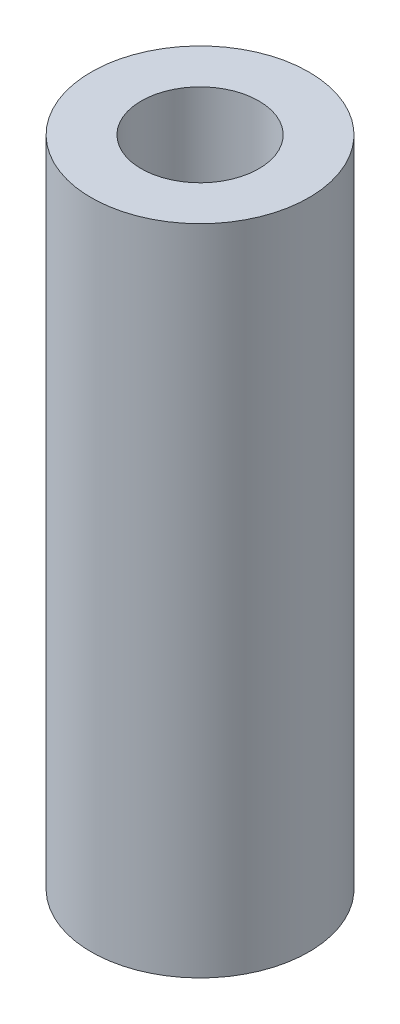
ISO-10303-21;
HEADER;
FILE_DESCRIPTION(('STEP AP214'),'2;1');
FILE_NAME('part.step','',(''),(''),'','','');
FILE_SCHEMA(('AUTOMOTIVE_DESIGN { 1 0 10303 214 1 1 1 1 }'));
ENDSEC;
DATA;
#1=APPLICATION_CONTEXT('core data for automotive mechanical design processes');
#2=APPLICATION_PROTOCOL_DEFINITION('international standard','automotive_design',2000,#1);
#3=PRODUCT_CONTEXT('',#1,'mechanical');
#4=PRODUCT('Part','Part','',(#3));
#5=PRODUCT_RELATED_PRODUCT_CATEGORY('part','',(#4));
#6=PRODUCT_DEFINITION_FORMATION('','',#4);
#7=PRODUCT_DEFINITION_CONTEXT('part definition',#1,'design');
#8=PRODUCT_DEFINITION('design','',#6,#7);
#9=PRODUCT_DEFINITION_SHAPE('','',#8);
#10=(LENGTH_UNIT() NAMED_UNIT(*) SI_UNIT(.MILLI.,.METRE.));
#11=(NAMED_UNIT(*) PLANE_ANGLE_UNIT() SI_UNIT($,.RADIAN.));
#12=(NAMED_UNIT(*) SI_UNIT($,.STERADIAN.) SOLID_ANGLE_UNIT());
#13=UNCERTAINTY_MEASURE_WITH_UNIT(LENGTH_MEASURE(1.E-05),#10,'distance_accuracy_value','');
#14=(GEOMETRIC_REPRESENTATION_CONTEXT(3) GLOBAL_UNCERTAINTY_ASSIGNED_CONTEXT((#13)) GLOBAL_UNIT_ASSIGNED_CONTEXT((#10,
#11,#12)) REPRESENTATION_CONTEXT('',''));
#15=CARTESIAN_POINT('',(0.,0.,0.));
#16=DIRECTION('',(0.,0.,1.));
#17=DIRECTION('',(1.,0.,0.));
#18=AXIS2_PLACEMENT_3D('',#15,#16,#17);
#19=CARTESIAN_POINT('',(0.,38.1,0.));
#20=DIRECTION('',(0.,1.,0.));
#21=DIRECTION('',(0.,0.,1.));
#22=AXIS2_PLACEMENT_3D('',#19,#20,#21);
#23=PLANE('',#22);
#24=CARTESIAN_POINT('',(0.,38.1,0.));
#25=DIRECTION('',(0.,1.,0.));
#26=DIRECTION('',(0.,0.,1.));
#27=AXIS2_PLACEMENT_3D('',#24,#25,#26);
#28=CIRCLE('',#27,6.35);
#29=CARTESIAN_POINT('',(0.,38.1,-6.35));
#30=VERTEX_POINT('',#29);
#31=EDGE_CURVE('E10',#30,#30,#28,.T.);
#32=ORIENTED_EDGE('',*,*,#31,.T.);
#33=EDGE_LOOP('',(#32));
#34=FACE_BOUND('',#33,.T.);
#35=CARTESIAN_POINT('',(0.,38.1,0.));
#36=DIRECTION('',(0.,1.,0.));
#37=DIRECTION('',(0.,0.,1.));
#38=AXIS2_PLACEMENT_3D('',#35,#36,#37);
#39=CIRCLE('',#38,3.429);
#40=CARTESIAN_POINT('',(0.,38.1,-3.429));
#41=VERTEX_POINT('',#40);
#42=EDGE_CURVE('E46',#41,#41,#39,.T.);
#43=ORIENTED_EDGE('',*,*,#42,.F.);
#44=EDGE_LOOP('',(#43));
#45=FACE_BOUND('',#44,.T.);
#46=ADVANCED_FACE('F35',(#34,#45),#23,.T.);
#47=CARTESIAN_POINT('',(0.,0.,0.));
#48=DIRECTION('',(0.,1.,0.));
#49=DIRECTION('',(0.,0.,1.));
#50=AXIS2_PLACEMENT_3D('',#47,#48,#49);
#51=PLANE('',#50);
#52=CARTESIAN_POINT('',(0.,0.,0.));
#53=DIRECTION('',(0.,1.,0.));
#54=DIRECTION('',(0.,0.,1.));
#55=AXIS2_PLACEMENT_3D('',#52,#53,#54);
#56=CIRCLE('',#55,6.35);
#57=CARTESIAN_POINT('',(0.,0.,-6.35));
#58=VERTEX_POINT('',#57);
#59=EDGE_CURVE('E39',#58,#58,#56,.T.);
#60=ORIENTED_EDGE('',*,*,#59,.F.);
#61=EDGE_LOOP('',(#60));
#62=FACE_BOUND('',#61,.T.);
#63=CARTESIAN_POINT('',(0.,0.,0.));
#64=DIRECTION('',(0.,1.,0.));
#65=DIRECTION('',(0.,0.,1.));
#66=AXIS2_PLACEMENT_3D('',#63,#64,#65);
#67=CIRCLE('',#66,3.429);
#68=CARTESIAN_POINT('',(0.,0.,-3.429));
#69=VERTEX_POINT('',#68);
#70=EDGE_CURVE('E48',#69,#69,#67,.T.);
#71=ORIENTED_EDGE('',*,*,#70,.T.);
#72=EDGE_LOOP('',(#71));
#73=FACE_BOUND('',#72,.T.);
#74=ADVANCED_FACE('F58',(#62,#73),#51,.F.);
#75=CARTESIAN_POINT('',(0.,38.1,0.));
#76=DIRECTION('',(0.,-1.,0.));
#77=DIRECTION('',(0.,0.,-1.));
#78=AXIS2_PLACEMENT_3D('',#75,#76,#77);
#79=CYLINDRICAL_SURFACE('',#78,6.35);
#80=CARTESIAN_POINT('',(0.,38.1,-6.35));
#81=CARTESIAN_POINT('',(0.,37.703125,-6.35));
#82=CARTESIAN_POINT('',(0.,37.30625,-6.35));
#83=CARTESIAN_POINT('',(0.,36.5125,-6.35));
#84=CARTESIAN_POINT('',(0.,36.115625,-6.35));
#85=CARTESIAN_POINT('',(0.,35.321875,-6.35));
#86=CARTESIAN_POINT('',(0.,34.925,-6.35));
#87=CARTESIAN_POINT('',(0.,34.13125,-6.35));
#88=CARTESIAN_POINT('',(0.,33.734375,-6.35));
#89=CARTESIAN_POINT('',(0.,32.940625,-6.35));
#90=CARTESIAN_POINT('',(0.,32.54375,-6.35));
#91=CARTESIAN_POINT('',(0.,31.75,-6.35));
#92=CARTESIAN_POINT('',(0.,31.353125,-6.35));
#93=CARTESIAN_POINT('',(0.,30.559375,-6.35));
#94=CARTESIAN_POINT('',(0.,30.1625,-6.35));
#95=CARTESIAN_POINT('',(0.,29.36875,-6.35));
#96=CARTESIAN_POINT('',(0.,28.971875,-6.35));
#97=CARTESIAN_POINT('',(0.,28.178125,-6.35));
#98=CARTESIAN_POINT('',(0.,27.78125,-6.35));
#99=CARTESIAN_POINT('',(0.,26.9875,-6.35));
#100=CARTESIAN_POINT('',(0.,26.590625,-6.35));
#101=CARTESIAN_POINT('',(0.,25.796875,-6.35));
#102=CARTESIAN_POINT('',(0.,25.4,-6.35));
#103=CARTESIAN_POINT('',(0.,24.60625,-6.35));
#104=CARTESIAN_POINT('',(0.,24.209375,-6.35));
#105=CARTESIAN_POINT('',(0.,23.415625,-6.35));
#106=CARTESIAN_POINT('',(0.,23.01875,-6.35));
#107=CARTESIAN_POINT('',(0.,22.225,-6.35));
#108=CARTESIAN_POINT('',(0.,21.828125,-6.35));
#109=CARTESIAN_POINT('',(0.,21.034375,-6.35));
#110=CARTESIAN_POINT('',(0.,20.6375,-6.35));
#111=CARTESIAN_POINT('',(0.,19.84375,-6.35));
#112=CARTESIAN_POINT('',(0.,19.446875,-6.35));
#113=CARTESIAN_POINT('',(0.,18.653125,-6.35));
#114=CARTESIAN_POINT('',(0.,18.25625,-6.35));
#115=CARTESIAN_POINT('',(0.,17.4625,-6.35));
#116=CARTESIAN_POINT('',(0.,17.065625,-6.35));
#117=CARTESIAN_POINT('',(0.,16.271875,-6.35));
#118=CARTESIAN_POINT('',(0.,15.875,-6.35));
#119=CARTESIAN_POINT('',(0.,15.08125,-6.35));
#120=CARTESIAN_POINT('',(0.,14.684375,-6.35));
#121=CARTESIAN_POINT('',(0.,13.890625,-6.35));
#122=CARTESIAN_POINT('',(0.,13.49375,-6.35));
#123=CARTESIAN_POINT('',(0.,12.7,-6.35));
#124=CARTESIAN_POINT('',(0.,12.303125,-6.35));
#125=CARTESIAN_POINT('',(0.,11.509375,-6.35));
#126=CARTESIAN_POINT('',(0.,11.1125,-6.35));
#127=CARTESIAN_POINT('',(0.,10.31875,-6.35));
#128=CARTESIAN_POINT('',(0.,9.921875,-6.35));
#129=CARTESIAN_POINT('',(0.,9.128125,-6.35));
#130=CARTESIAN_POINT('',(0.,8.73125,-6.35));
#131=CARTESIAN_POINT('',(0.,7.9375,-6.35));
#132=CARTESIAN_POINT('',(0.,7.540625,-6.35));
#133=CARTESIAN_POINT('',(0.,6.746875,-6.35));
#134=CARTESIAN_POINT('',(0.,6.35,-6.35));
#135=CARTESIAN_POINT('',(0.,5.55625,-6.35));
#136=CARTESIAN_POINT('',(0.,5.159375,-6.35));
#137=CARTESIAN_POINT('',(0.,4.365625,-6.35));
#138=CARTESIAN_POINT('',(0.,3.96875,-6.35));
#139=CARTESIAN_POINT('',(0.,3.175,-6.35));
#140=CARTESIAN_POINT('',(0.,2.778125,-6.35));
#141=CARTESIAN_POINT('',(0.,1.984375,-6.35));
#142=CARTESIAN_POINT('',(0.,1.5875,-6.35));
#143=CARTESIAN_POINT('',(0.,0.79375,-6.35));
#144=CARTESIAN_POINT('',(0.,0.396875,-6.35));
#145=CARTESIAN_POINT('',(0.,0.,-6.35));
#146=B_SPLINE_CURVE_WITH_KNOTS('',3,(#80,#81,#82,#83,#84,#85,#86,#87,#88,#89,#90,#91,#92,#93,
#94,#95,#96,#97,#98,#99,#100,#101,#102,#103,#104,#105,#106,#107,#108,#109,#110,#111,#112,#113,
#114,#115,#116,#117,#118,#119,#120,#121,#122,#123,#124,#125,#126,#127,#128,#129,#130,#131,#132,
#133,#134,#135,#136,#137,#138,#139,#140,#141,#142,#143,#144,#145),.UNSPECIFIED.,.F.,.F.,(4,2,2,
2,2,2,2,2,2,2,2,2,2,2,2,2,2,2,2,2,2,2,2,2,2,2,2,2,2,2,2,2,4),(0.,1.19062499999999,
2.38124999999999,3.571875,4.7625,5.953125,7.14375,8.33437499999999,9.525,10.715625,11.90625,
13.096875,14.2875,15.478125,16.66875,17.859375,19.05,20.240625,21.43125,22.621875,23.8125,
25.003125,26.19375,27.384375,28.575,29.765625,30.95625,32.146875,33.3375,34.528125,35.71875,
36.909375,38.1),.UNSPECIFIED.);
#147=EDGE_CURVE('BSEAM37',#30,#58,#146,.T.);
#148=ORIENTED_EDGE('',*,*,#31,.F.);
#149=ORIENTED_EDGE('',*,*,#59,.T.);
#150=ORIENTED_EDGE('',*,*,#147,.T.);
#151=ORIENTED_EDGE('',*,*,#147,.F.);
#152=EDGE_LOOP('',(#148,#150,#149,#151));
#153=FACE_BOUND('',#152,.T.);
#154=ADVANCED_FACE('F37',(#153),#79,.T.);
#155=CARTESIAN_POINT('',(0.,38.1,0.));
#156=DIRECTION('',(0.,-1.,0.));
#157=DIRECTION('',(0.,0.,-1.));
#158=AXIS2_PLACEMENT_3D('',#155,#156,#157);
#159=CYLINDRICAL_SURFACE('',#158,3.429);
#160=CARTESIAN_POINT('',(0.,38.1,-3.429));
#161=CARTESIAN_POINT('',(0.,37.703125,-3.429));
#162=CARTESIAN_POINT('',(0.,37.30625,-3.429));
#163=CARTESIAN_POINT('',(0.,36.5125,-3.429));
#164=CARTESIAN_POINT('',(0.,36.115625,-3.429));
#165=CARTESIAN_POINT('',(0.,35.321875,-3.429));
#166=CARTESIAN_POINT('',(0.,34.925,-3.429));
#167=CARTESIAN_POINT('',(0.,34.13125,-3.429));
#168=CARTESIAN_POINT('',(0.,33.734375,-3.429));
#169=CARTESIAN_POINT('',(0.,32.940625,-3.429));
#170=CARTESIAN_POINT('',(0.,32.54375,-3.429));
#171=CARTESIAN_POINT('',(0.,31.75,-3.429));
#172=CARTESIAN_POINT('',(0.,31.353125,-3.429));
#173=CARTESIAN_POINT('',(0.,30.559375,-3.429));
#174=CARTESIAN_POINT('',(0.,30.1625,-3.429));
#175=CARTESIAN_POINT('',(0.,29.36875,-3.429));
#176=CARTESIAN_POINT('',(0.,28.971875,-3.429));
#177=CARTESIAN_POINT('',(0.,28.178125,-3.429));
#178=CARTESIAN_POINT('',(0.,27.78125,-3.429));
#179=CARTESIAN_POINT('',(0.,26.9875,-3.429));
#180=CARTESIAN_POINT('',(0.,26.590625,-3.429));
#181=CARTESIAN_POINT('',(0.,25.796875,-3.429));
#182=CARTESIAN_POINT('',(0.,25.4,-3.429));
#183=CARTESIAN_POINT('',(0.,24.60625,-3.429));
#184=CARTESIAN_POINT('',(0.,24.209375,-3.429));
#185=CARTESIAN_POINT('',(0.,23.415625,-3.429));
#186=CARTESIAN_POINT('',(0.,23.01875,-3.429));
#187=CARTESIAN_POINT('',(0.,22.225,-3.429));
#188=CARTESIAN_POINT('',(0.,21.828125,-3.429));
#189=CARTESIAN_POINT('',(0.,21.034375,-3.429));
#190=CARTESIAN_POINT('',(0.,20.6375,-3.429));
#191=CARTESIAN_POINT('',(0.,19.84375,-3.429));
#192=CARTESIAN_POINT('',(0.,19.446875,-3.429));
#193=CARTESIAN_POINT('',(0.,18.653125,-3.429));
#194=CARTESIAN_POINT('',(0.,18.25625,-3.429));
#195=CARTESIAN_POINT('',(0.,17.4625,-3.429));
#196=CARTESIAN_POINT('',(0.,17.065625,-3.429));
#197=CARTESIAN_POINT('',(0.,16.271875,-3.429));
#198=CARTESIAN_POINT('',(0.,15.875,-3.429));
#199=CARTESIAN_POINT('',(0.,15.08125,-3.429));
#200=CARTESIAN_POINT('',(0.,14.684375,-3.429));
#201=CARTESIAN_POINT('',(0.,13.890625,-3.429));
#202=CARTESIAN_POINT('',(0.,13.49375,-3.429));
#203=CARTESIAN_POINT('',(0.,12.7,-3.429));
#204=CARTESIAN_POINT('',(0.,12.303125,-3.429));
#205=CARTESIAN_POINT('',(0.,11.509375,-3.429));
#206=CARTESIAN_POINT('',(0.,11.1125,-3.429));
#207=CARTESIAN_POINT('',(0.,10.31875,-3.429));
#208=CARTESIAN_POINT('',(0.,9.921875,-3.429));
#209=CARTESIAN_POINT('',(0.,9.128125,-3.429));
#210=CARTESIAN_POINT('',(0.,8.73125,-3.429));
#211=CARTESIAN_POINT('',(0.,7.9375,-3.429));
#212=CARTESIAN_POINT('',(0.,7.540625,-3.429));
#213=CARTESIAN_POINT('',(0.,6.746875,-3.429));
#214=CARTESIAN_POINT('',(0.,6.35,-3.429));
#215=CARTESIAN_POINT('',(0.,5.55625,-3.429));
#216=CARTESIAN_POINT('',(0.,5.159375,-3.429));
#217=CARTESIAN_POINT('',(0.,4.365625,-3.429));
#218=CARTESIAN_POINT('',(0.,3.96875,-3.429));
#219=CARTESIAN_POINT('',(0.,3.175,-3.429));
#220=CARTESIAN_POINT('',(0.,2.778125,-3.429));
#221=CARTESIAN_POINT('',(0.,1.984375,-3.429));
#222=CARTESIAN_POINT('',(0.,1.5875,-3.429));
#223=CARTESIAN_POINT('',(0.,0.79375,-3.429));
#224=CARTESIAN_POINT('',(0.,0.396875,-3.429));
#225=CARTESIAN_POINT('',(0.,0.,-3.429));
#226=B_SPLINE_CURVE_WITH_KNOTS('',3,(#160,#161,#162,#163,#164,#165,#166,#167,#168,#169,#170,
#171,#172,#173,#174,#175,#176,#177,#178,#179,#180,#181,#182,#183,#184,#185,#186,#187,#188,#189,
#190,#191,#192,#193,#194,#195,#196,#197,#198,#199,#200,#201,#202,#203,#204,#205,#206,#207,#208,
#209,#210,#211,#212,#213,#214,#215,#216,#217,#218,#219,#220,#221,#222,#223,#224,#225),
.UNSPECIFIED.,.F.,.F.,(4,2,2,2,2,2,2,2,2,2,2,2,2,2,2,2,2,2,2,2,2,2,2,2,2,2,2,2,2,2,2,2,4),(0.,
1.19062499999999,2.38124999999999,3.571875,4.7625,5.953125,7.14375,8.33437499999999,9.525,
10.715625,11.90625,13.096875,14.2875,15.478125,16.66875,17.859375,19.05,20.240625,21.43125,
22.621875,23.8125,25.003125,26.19375,27.384375,28.575,29.765625,30.95625,32.146875,33.3375,
34.528125,35.71875,36.909375,38.1),.UNSPECIFIED.);
#227=EDGE_CURVE('BSEAM54',#41,#69,#226,.T.);
#228=ORIENTED_EDGE('',*,*,#42,.T.);
#229=ORIENTED_EDGE('',*,*,#70,.F.);
#230=ORIENTED_EDGE('',*,*,#227,.T.);
#231=ORIENTED_EDGE('',*,*,#227,.F.);
#232=EDGE_LOOP('',(#228,#230,#229,#231));
#233=FACE_BOUND('',#232,.T.);
#234=ADVANCED_FACE('F54',(#233),#159,.F.);
#235=CLOSED_SHELL('',(#46,#74,#154,#234));
#236=MANIFOLD_SOLID_BREP('B2',#235);
#237=ADVANCED_BREP_SHAPE_REPRESENTATION('',(#18,#236),#14);
#238=SHAPE_DEFINITION_REPRESENTATION(#9,#237);
ENDSEC;
END-ISO-10303-21;
